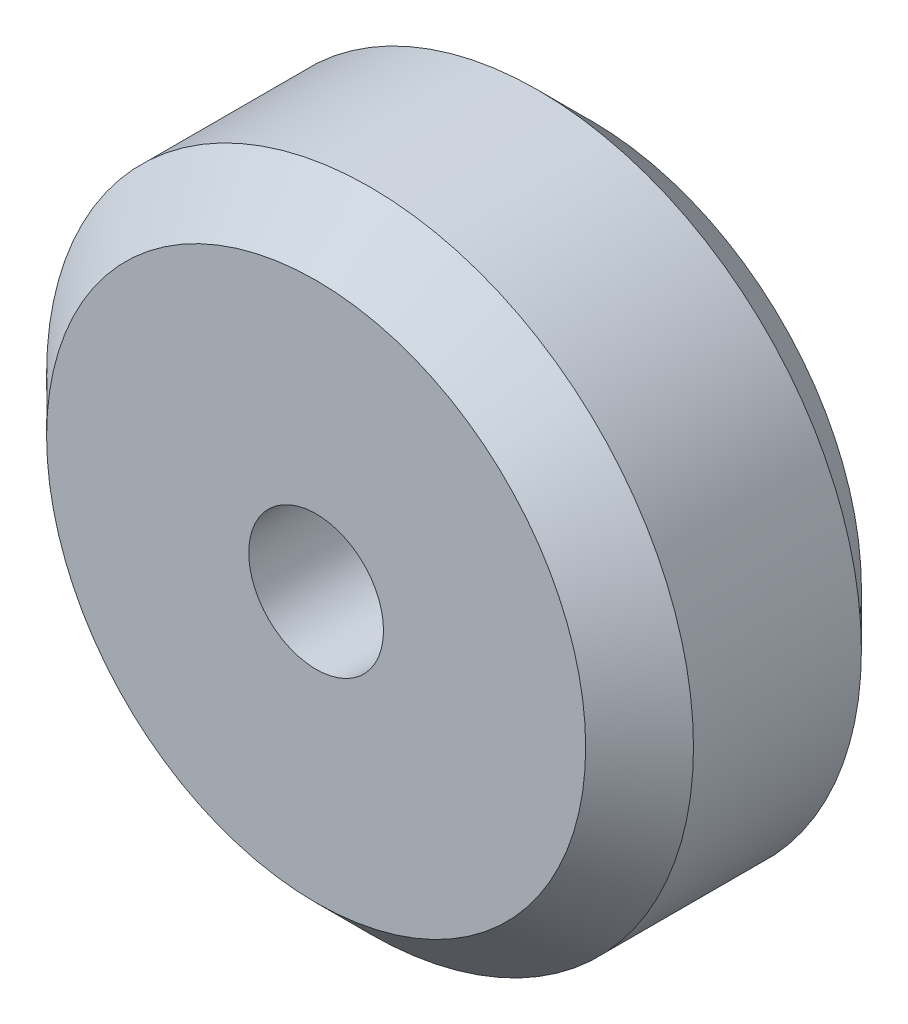
ISO-10303-21;
HEADER;
FILE_DESCRIPTION(('STEP AP214'),'2;1');
FILE_NAME('part.step','',(''),(''),'','','');
FILE_SCHEMA(('AUTOMOTIVE_DESIGN { 1 0 10303 214 1 1 1 1 }'));
ENDSEC;
DATA;
#1=APPLICATION_CONTEXT('core data for automotive mechanical design processes');
#2=APPLICATION_PROTOCOL_DEFINITION('international standard','automotive_design',2000,#1);
#3=PRODUCT_CONTEXT('',#1,'mechanical');
#4=PRODUCT('Part','Part','',(#3));
#5=PRODUCT_RELATED_PRODUCT_CATEGORY('part','',(#4));
#6=PRODUCT_DEFINITION_FORMATION('','',#4);
#7=PRODUCT_DEFINITION_CONTEXT('part definition',#1,'design');
#8=PRODUCT_DEFINITION('design','',#6,#7);
#9=PRODUCT_DEFINITION_SHAPE('','',#8);
#10=(LENGTH_UNIT() NAMED_UNIT(*) SI_UNIT(.MILLI.,.METRE.));
#11=(NAMED_UNIT(*) PLANE_ANGLE_UNIT() SI_UNIT($,.RADIAN.));
#12=(NAMED_UNIT(*) SI_UNIT($,.STERADIAN.) SOLID_ANGLE_UNIT());
#13=UNCERTAINTY_MEASURE_WITH_UNIT(LENGTH_MEASURE(1.E-05),#10,'distance_accuracy_value','');
#14=(GEOMETRIC_REPRESENTATION_CONTEXT(3) GLOBAL_UNCERTAINTY_ASSIGNED_CONTEXT((#13)) GLOBAL_UNIT_ASSIGNED_CONTEXT((#10,
#11,#12)) REPRESENTATION_CONTEXT('',''));
#15=CARTESIAN_POINT('',(0.,0.,0.));
#16=DIRECTION('',(0.,0.,1.));
#17=DIRECTION('',(1.,0.,0.));
#18=AXIS2_PLACEMENT_3D('',#15,#16,#17);
#19=CARTESIAN_POINT('',(0.,0.,10.23));
#20=DIRECTION('',(0.,0.,-1.));
#21=DIRECTION('',(-1.,0.,0.));
#22=AXIS2_PLACEMENT_3D('',#19,#20,#21);
#23=CYLINDRICAL_SURFACE('',#22,12.);
#24=CARTESIAN_POINT('',(0.,0.,1.99999999999999));
#25=DIRECTION('',(0.,0.,1.));
#26=DIRECTION('',(1.,0.,0.));
#27=AXIS2_PLACEMENT_3D('',#24,#25,#26);
#28=CIRCLE('',#27,12.);
#29=CARTESIAN_POINT('',(12.,0.,1.99999999999999));
#30=VERTEX_POINT('',#29);
#31=EDGE_CURVE('E47',#30,#30,#28,.T.);
#32=ORIENTED_EDGE('',*,*,#31,.T.);
#33=EDGE_LOOP('',(#32));
#34=FACE_BOUND('',#33,.T.);
#35=CARTESIAN_POINT('',(0.,0.,8.23));
#36=DIRECTION('',(0.,0.,1.));
#37=DIRECTION('',(1.,0.,0.));
#38=AXIS2_PLACEMENT_3D('',#35,#36,#37);
#39=CIRCLE('',#38,12.);
#40=CARTESIAN_POINT('',(12.,0.,8.23));
#41=VERTEX_POINT('',#40);
#42=EDGE_CURVE('E51',#41,#41,#39,.F.);
#43=ORIENTED_EDGE('',*,*,#42,.T.);
#44=EDGE_LOOP('',(#43));
#45=FACE_BOUND('',#44,.T.);
#46=ADVANCED_FACE('F39',(#34,#45),#23,.T.);
#47=CARTESIAN_POINT('',(0.,0.,10.23));
#48=DIRECTION('',(0.,0.,1.));
#49=DIRECTION('',(1.,0.,0.));
#50=AXIS2_PLACEMENT_3D('',#47,#48,#49);
#51=PLANE('',#50);
#52=CARTESIAN_POINT('',(0.,0.,10.23));
#53=DIRECTION('',(0.,0.,1.));
#54=DIRECTION('',(1.,0.,0.));
#55=AXIS2_PLACEMENT_3D('',#52,#53,#54);
#56=CIRCLE('',#55,10.);
#57=CARTESIAN_POINT('',(10.,0.,10.23));
#58=VERTEX_POINT('',#57);
#59=EDGE_CURVE('E55',#58,#58,#56,.T.);
#60=ORIENTED_EDGE('',*,*,#59,.T.);
#61=EDGE_LOOP('',(#60));
#62=FACE_BOUND('',#61,.T.);
#63=CARTESIAN_POINT('',(0.,0.,10.23));
#64=DIRECTION('',(0.,0.,1.));
#65=DIRECTION('',(1.,0.,0.));
#66=AXIS2_PLACEMENT_3D('',#63,#64,#65);
#67=CIRCLE('',#66,2.5);
#68=CARTESIAN_POINT('',(2.5,0.,10.23));
#69=VERTEX_POINT('',#68);
#70=EDGE_CURVE('E61',#69,#69,#67,.T.);
#71=ORIENTED_EDGE('',*,*,#70,.F.);
#72=EDGE_LOOP('',(#71));
#73=FACE_BOUND('',#72,.T.);
#74=ADVANCED_FACE('F76',(#62,#73),#51,.T.);
#75=CARTESIAN_POINT('',(0.,0.,0.));
#76=DIRECTION('',(0.,0.,1.));
#77=DIRECTION('',(1.,0.,0.));
#78=AXIS2_PLACEMENT_3D('',#75,#76,#77);
#79=PLANE('',#78);
#80=CARTESIAN_POINT('',(0.,0.,0.));
#81=DIRECTION('',(0.,0.,1.));
#82=DIRECTION('',(1.,0.,0.));
#83=AXIS2_PLACEMENT_3D('',#80,#81,#82);
#84=CIRCLE('',#83,10.);
#85=CARTESIAN_POINT('',(10.,0.,0.));
#86=VERTEX_POINT('',#85);
#87=EDGE_CURVE('E10',#86,#86,#84,.F.);
#88=ORIENTED_EDGE('',*,*,#87,.T.);
#89=EDGE_LOOP('',(#88));
#90=FACE_BOUND('',#89,.T.);
#91=CARTESIAN_POINT('',(0.,0.,0.));
#92=DIRECTION('',(0.,0.,1.));
#93=DIRECTION('',(1.,0.,0.));
#94=AXIS2_PLACEMENT_3D('',#91,#92,#93);
#95=CIRCLE('',#94,2.5);
#96=CARTESIAN_POINT('',(2.5,0.,0.));
#97=VERTEX_POINT('',#96);
#98=EDGE_CURVE('E60',#97,#97,#95,.T.);
#99=ORIENTED_EDGE('',*,*,#98,.T.);
#100=EDGE_LOOP('',(#99));
#101=FACE_BOUND('',#100,.T.);
#102=ADVANCED_FACE('F67',(#90,#101),#79,.F.);
#103=CARTESIAN_POINT('',(0.,0.,0.));
#104=DIRECTION('',(0.,0.,1.));
#105=DIRECTION('',(1.,0.,0.));
#106=AXIS2_PLACEMENT_3D('',#103,#104,#105);
#107=CYLINDRICAL_SURFACE('',#106,2.5);
#108=ORIENTED_EDGE('',*,*,#98,.F.);
#109=EDGE_LOOP('',(#108));
#110=FACE_BOUND('',#109,.T.);
#111=ORIENTED_EDGE('',*,*,#70,.T.);
#112=EDGE_LOOP('',(#111));
#113=FACE_BOUND('',#112,.T.);
#114=ADVANCED_FACE('F69',(#110,#113),#107,.F.);
#115=CARTESIAN_POINT('',(0.,0.,10.23));
#116=DIRECTION('',(0.,0.,-1.));
#117=DIRECTION('',(-1.,0.,0.));
#118=AXIS2_PLACEMENT_3D('',#115,#116,#117);
#119=CONICAL_SURFACE('',#118,10.,0.785398163397448);
#120=ORIENTED_EDGE('',*,*,#42,.F.);
#121=EDGE_LOOP('',(#120));
#122=FACE_BOUND('',#121,.T.);
#123=ORIENTED_EDGE('',*,*,#59,.F.);
#124=EDGE_LOOP('',(#123));
#125=FACE_BOUND('',#124,.T.);
#126=ADVANCED_FACE('F72',(#122,#125),#119,.T.);
#127=CARTESIAN_POINT('',(0.,0.,1.99999999999999));
#128=DIRECTION('',(0.,0.,1.));
#129=DIRECTION('',(1.,0.,0.));
#130=AXIS2_PLACEMENT_3D('',#127,#128,#129);
#131=CONICAL_SURFACE('',#130,12.,0.78539816339745);
#132=ORIENTED_EDGE('',*,*,#87,.F.);
#133=EDGE_LOOP('',(#132));
#134=FACE_BOUND('',#133,.T.);
#135=ORIENTED_EDGE('',*,*,#31,.F.);
#136=EDGE_LOOP('',(#135));
#137=FACE_BOUND('',#136,.T.);
#138=ADVANCED_FACE('F42',(#134,#137),#131,.T.);
#139=CLOSED_SHELL('',(#46,#74,#102,#114,#126,#138));
#140=MANIFOLD_SOLID_BREP('B2',#139);
#141=ADVANCED_BREP_SHAPE_REPRESENTATION('',(#18,#140),#14);
#142=SHAPE_DEFINITION_REPRESENTATION(#9,#141);
ENDSEC;
END-ISO-10303-21;
